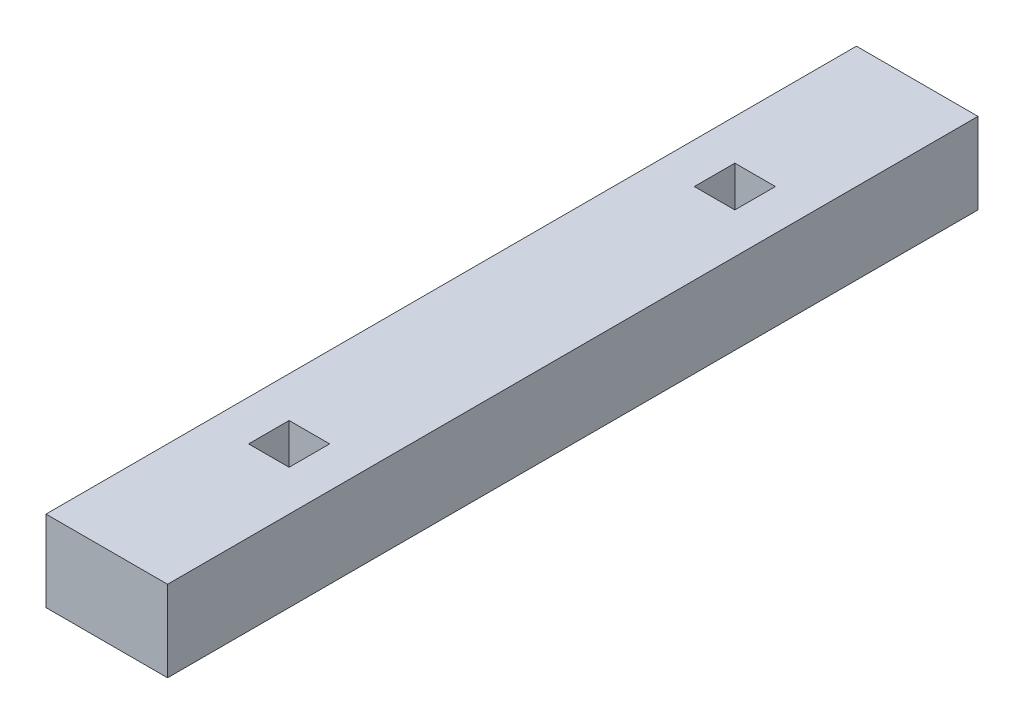
ISO-10303-21;
HEADER;
FILE_DESCRIPTION(('STEP AP214'),'2;1');
FILE_NAME('part.step','',(''),(''),'','','');
FILE_SCHEMA(('AUTOMOTIVE_DESIGN { 1 0 10303 214 1 1 1 1 }'));
ENDSEC;
DATA;
#1=APPLICATION_CONTEXT('core data for automotive mechanical design processes');
#2=APPLICATION_PROTOCOL_DEFINITION('international standard','automotive_design',2000,#1);
#3=PRODUCT_CONTEXT('',#1,'mechanical');
#4=PRODUCT('Part','Part','',(#3));
#5=PRODUCT_RELATED_PRODUCT_CATEGORY('part','',(#4));
#6=PRODUCT_DEFINITION_FORMATION('','',#4);
#7=PRODUCT_DEFINITION_CONTEXT('part definition',#1,'design');
#8=PRODUCT_DEFINITION('design','',#6,#7);
#9=PRODUCT_DEFINITION_SHAPE('','',#8);
#10=(LENGTH_UNIT() NAMED_UNIT(*) SI_UNIT(.MILLI.,.METRE.));
#11=(NAMED_UNIT(*) PLANE_ANGLE_UNIT() SI_UNIT($,.RADIAN.));
#12=(NAMED_UNIT(*) SI_UNIT($,.STERADIAN.) SOLID_ANGLE_UNIT());
#13=UNCERTAINTY_MEASURE_WITH_UNIT(LENGTH_MEASURE(1.E-05),#10,'distance_accuracy_value','');
#14=(GEOMETRIC_REPRESENTATION_CONTEXT(3) GLOBAL_UNCERTAINTY_ASSIGNED_CONTEXT((#13)) GLOBAL_UNIT_ASSIGNED_CONTEXT((#10,
#11,#12)) REPRESENTATION_CONTEXT('',''));
#15=CARTESIAN_POINT('',(0.,0.,0.));
#16=DIRECTION('',(0.,0.,1.));
#17=DIRECTION('',(1.,0.,0.));
#18=AXIS2_PLACEMENT_3D('',#15,#16,#17);
#19=CARTESIAN_POINT('',(0.,20.,0.));
#20=DIRECTION('',(0.,1.,0.));
#21=DIRECTION('',(0.,0.,1.));
#22=AXIS2_PLACEMENT_3D('',#19,#20,#21);
#23=PLANE('',#22);
#24=DIRECTION('',(0.,0.,1.));
#25=VECTOR('',#24,1.);
#26=CARTESIAN_POINT('',(-15.,20.,-95.));
#27=LINE('',#26,#25);
#28=CARTESIAN_POINT('',(-15.,20.,-95.));
#29=VERTEX_POINT('',#28);
#30=CARTESIAN_POINT('',(-15.,20.,105.));
#31=VERTEX_POINT('',#30);
#32=EDGE_CURVE('E189',#29,#31,#27,.T.);
#33=ORIENTED_EDGE('',*,*,#32,.T.);
#34=DIRECTION('',(1.,0.,0.));
#35=VECTOR('',#34,1.);
#36=CARTESIAN_POINT('',(-15.,20.,105.));
#37=LINE('',#36,#35);
#38=CARTESIAN_POINT('',(15.,20.,105.));
#39=VERTEX_POINT('',#38);
#40=EDGE_CURVE('E192',#31,#39,#37,.T.);
#41=ORIENTED_EDGE('',*,*,#40,.T.);
#42=DIRECTION('',(0.,0.,-1.));
#43=VECTOR('',#42,1.);
#44=CARTESIAN_POINT('',(15.,20.,-95.));
#45=LINE('',#44,#43);
#46=CARTESIAN_POINT('',(15.,20.,-95.));
#47=VERTEX_POINT('',#46);
#48=EDGE_CURVE('E195',#39,#47,#45,.T.);
#49=ORIENTED_EDGE('',*,*,#48,.T.);
#50=DIRECTION('',(-1.,0.,0.));
#51=VECTOR('',#50,1.);
#52=CARTESIAN_POINT('',(-15.,20.,-95.));
#53=LINE('',#52,#51);
#54=EDGE_CURVE('E197',#47,#29,#53,.T.);
#55=ORIENTED_EDGE('',*,*,#54,.T.);
#56=EDGE_LOOP('',(#33,#41,#49,#55));
#57=FACE_BOUND('',#56,.T.);
#58=DIRECTION('',(1.,0.,0.));
#59=VECTOR('',#58,1.);
#60=CARTESIAN_POINT('',(-5.,20.,-45.));
#61=LINE('',#60,#59);
#62=CARTESIAN_POINT('',(-5.,20.,-45.));
#63=VERTEX_POINT('',#62);
#64=CARTESIAN_POINT('',(5.,20.,-45.));
#65=VERTEX_POINT('',#64);
#66=EDGE_CURVE('E160',#63,#65,#61,.T.);
#67=ORIENTED_EDGE('',*,*,#66,.F.);
#68=DIRECTION('',(0.,0.,1.));
#69=VECTOR('',#68,1.);
#70=CARTESIAN_POINT('',(-5.,20.,-55.));
#71=LINE('',#70,#69);
#72=CARTESIAN_POINT('',(-5.,20.,-55.));
#73=VERTEX_POINT('',#72);
#74=EDGE_CURVE('E158',#73,#63,#71,.T.);
#75=ORIENTED_EDGE('',*,*,#74,.F.);
#76=DIRECTION('',(-1.,0.,0.));
#77=VECTOR('',#76,1.);
#78=CARTESIAN_POINT('',(-5.,20.,-55.));
#79=LINE('',#78,#77);
#80=CARTESIAN_POINT('',(5.,20.,-55.));
#81=VERTEX_POINT('',#80);
#82=EDGE_CURVE('E166',#81,#73,#79,.T.);
#83=ORIENTED_EDGE('',*,*,#82,.F.);
#84=DIRECTION('',(0.,0.,-1.));
#85=VECTOR('',#84,1.);
#86=CARTESIAN_POINT('',(5.,20.,-55.));
#87=LINE('',#86,#85);
#88=EDGE_CURVE('E163',#65,#81,#87,.T.);
#89=ORIENTED_EDGE('',*,*,#88,.F.);
#90=EDGE_LOOP('',(#67,#75,#83,#89));
#91=FACE_BOUND('',#90,.T.);
#92=DIRECTION('',(0.,0.,-1.));
#93=VECTOR('',#92,1.);
#94=CARTESIAN_POINT('',(5.,20.,65.));
#95=LINE('',#94,#93);
#96=CARTESIAN_POINT('',(5.,20.,65.));
#97=VERTEX_POINT('',#96);
#98=CARTESIAN_POINT('',(5.,20.,55.));
#99=VERTEX_POINT('',#98);
#100=EDGE_CURVE('E130',#97,#99,#95,.T.);
#101=ORIENTED_EDGE('',*,*,#100,.F.);
#102=DIRECTION('',(1.,0.,0.));
#103=VECTOR('',#102,1.);
#104=CARTESIAN_POINT('',(-5.,20.,65.));
#105=LINE('',#104,#103);
#106=CARTESIAN_POINT('',(-5.,20.,65.));
#107=VERTEX_POINT('',#106);
#108=EDGE_CURVE('E122',#107,#97,#105,.T.);
#109=ORIENTED_EDGE('',*,*,#108,.F.);
#110=DIRECTION('',(0.,0.,1.));
#111=VECTOR('',#110,1.);
#112=CARTESIAN_POINT('',(-5.,20.,65.));
#113=LINE('',#112,#111);
#114=CARTESIAN_POINT('',(-5.,20.,55.));
#115=VERTEX_POINT('',#114);
#116=EDGE_CURVE('E144',#115,#107,#113,.T.);
#117=ORIENTED_EDGE('',*,*,#116,.F.);
#118=DIRECTION('',(-1.,0.,0.));
#119=VECTOR('',#118,1.);
#120=CARTESIAN_POINT('',(-5.,20.,55.));
#121=LINE('',#120,#119);
#122=EDGE_CURVE('E142',#99,#115,#121,.T.);
#123=ORIENTED_EDGE('',*,*,#122,.F.);
#124=EDGE_LOOP('',(#101,#109,#117,#123));
#125=FACE_BOUND('',#124,.T.);
#126=ADVANCED_FACE('F33',(#57,#91,#125),#23,.T.);
#127=CARTESIAN_POINT('',(0.,0.,0.));
#128=DIRECTION('',(0.,1.,0.));
#129=DIRECTION('',(0.,0.,1.));
#130=AXIS2_PLACEMENT_3D('',#127,#128,#129);
#131=PLANE('',#130);
#132=DIRECTION('',(0.,0.,1.));
#133=VECTOR('',#132,1.);
#134=CARTESIAN_POINT('',(-5.,0.,-55.));
#135=LINE('',#134,#133);
#136=CARTESIAN_POINT('',(-5.,0.,-55.));
#137=VERTEX_POINT('',#136);
#138=CARTESIAN_POINT('',(-5.,0.,-45.));
#139=VERTEX_POINT('',#138);
#140=EDGE_CURVE('E138',#137,#139,#135,.T.);
#141=ORIENTED_EDGE('',*,*,#140,.T.);
#142=DIRECTION('',(1.,0.,0.));
#143=VECTOR('',#142,1.);
#144=CARTESIAN_POINT('',(-5.,0.,-45.));
#145=LINE('',#144,#143);
#146=CARTESIAN_POINT('',(5.,0.,-45.));
#147=VERTEX_POINT('',#146);
#148=EDGE_CURVE('E171',#139,#147,#145,.T.);
#149=ORIENTED_EDGE('',*,*,#148,.T.);
#150=DIRECTION('',(0.,0.,-1.));
#151=VECTOR('',#150,1.);
#152=CARTESIAN_POINT('',(5.,0.,-55.));
#153=LINE('',#152,#151);
#154=CARTESIAN_POINT('',(5.,0.,-55.));
#155=VERTEX_POINT('',#154);
#156=EDGE_CURVE('E174',#147,#155,#153,.T.);
#157=ORIENTED_EDGE('',*,*,#156,.T.);
#158=DIRECTION('',(-1.,0.,0.));
#159=VECTOR('',#158,1.);
#160=CARTESIAN_POINT('',(-5.,0.,-55.));
#161=LINE('',#160,#159);
#162=EDGE_CURVE('E161',#155,#137,#161,.T.);
#163=ORIENTED_EDGE('',*,*,#162,.T.);
#164=EDGE_LOOP('',(#141,#149,#157,#163));
#165=FACE_BOUND('',#164,.T.);
#166=DIRECTION('',(0.,0.,1.));
#167=VECTOR('',#166,1.);
#168=CARTESIAN_POINT('',(-15.,0.,-95.));
#169=LINE('',#168,#167);
#170=CARTESIAN_POINT('',(-15.,0.,-95.));
#171=VERTEX_POINT('',#170);
#172=CARTESIAN_POINT('',(-15.,0.,105.));
#173=VERTEX_POINT('',#172);
#174=EDGE_CURVE('E188',#171,#173,#169,.T.);
#175=ORIENTED_EDGE('',*,*,#174,.F.);
#176=DIRECTION('',(-1.,0.,0.));
#177=VECTOR('',#176,1.);
#178=CARTESIAN_POINT('',(-15.,0.,-95.));
#179=LINE('',#178,#177);
#180=CARTESIAN_POINT('',(15.,0.,-95.));
#181=VERTEX_POINT('',#180);
#182=EDGE_CURVE('E193',#181,#171,#179,.T.);
#183=ORIENTED_EDGE('',*,*,#182,.F.);
#184=DIRECTION('',(0.,0.,-1.));
#185=VECTOR('',#184,1.);
#186=CARTESIAN_POINT('',(15.,0.,-95.));
#187=LINE('',#186,#185);
#188=CARTESIAN_POINT('',(15.,0.,105.));
#189=VERTEX_POINT('',#188);
#190=EDGE_CURVE('E204',#189,#181,#187,.T.);
#191=ORIENTED_EDGE('',*,*,#190,.F.);
#192=DIRECTION('',(1.,0.,0.));
#193=VECTOR('',#192,1.);
#194=CARTESIAN_POINT('',(-15.,0.,105.));
#195=LINE('',#194,#193);
#196=EDGE_CURVE('E202',#173,#189,#195,.T.);
#197=ORIENTED_EDGE('',*,*,#196,.F.);
#198=EDGE_LOOP('',(#175,#183,#191,#197));
#199=FACE_BOUND('',#198,.T.);
#200=DIRECTION('',(1.,0.,0.));
#201=VECTOR('',#200,1.);
#202=CARTESIAN_POINT('',(-5.,0.,65.));
#203=LINE('',#202,#201);
#204=CARTESIAN_POINT('',(-5.,0.,65.));
#205=VERTEX_POINT('',#204);
#206=CARTESIAN_POINT('',(5.,0.,65.));
#207=VERTEX_POINT('',#206);
#208=EDGE_CURVE('E56',#205,#207,#203,.T.);
#209=ORIENTED_EDGE('',*,*,#208,.T.);
#210=DIRECTION('',(0.,0.,-1.));
#211=VECTOR('',#210,1.);
#212=CARTESIAN_POINT('',(5.,0.,65.));
#213=LINE('',#212,#211);
#214=CARTESIAN_POINT('',(5.,0.,55.));
#215=VERTEX_POINT('',#214);
#216=EDGE_CURVE('E137',#207,#215,#213,.T.);
#217=ORIENTED_EDGE('',*,*,#216,.T.);
#218=DIRECTION('',(-1.,0.,0.));
#219=VECTOR('',#218,1.);
#220=CARTESIAN_POINT('',(-5.,0.,55.));
#221=LINE('',#220,#219);
#222=CARTESIAN_POINT('',(-5.,0.,55.));
#223=VERTEX_POINT('',#222);
#224=EDGE_CURVE('E150',#215,#223,#221,.T.);
#225=ORIENTED_EDGE('',*,*,#224,.T.);
#226=DIRECTION('',(0.,0.,1.));
#227=VECTOR('',#226,1.);
#228=CARTESIAN_POINT('',(-5.,0.,65.));
#229=LINE('',#228,#227);
#230=EDGE_CURVE('E131',#223,#205,#229,.T.);
#231=ORIENTED_EDGE('',*,*,#230,.T.);
#232=EDGE_LOOP('',(#209,#217,#225,#231));
#233=FACE_BOUND('',#232,.T.);
#234=ADVANCED_FACE('F222',(#165,#199,#233),#131,.F.);
#235=CARTESIAN_POINT('',(-15.,20.,-95.));
#236=DIRECTION('',(1.,0.,0.));
#237=DIRECTION('',(0.,0.,-1.));
#238=AXIS2_PLACEMENT_3D('',#235,#236,#237);
#239=PLANE('',#238);
#240=ORIENTED_EDGE('',*,*,#174,.T.);
#241=DIRECTION('',(0.,-1.,0.));
#242=VECTOR('',#241,1.);
#243=CARTESIAN_POINT('',(-15.,20.,105.));
#244=LINE('',#243,#242);
#245=EDGE_CURVE('E11',#31,#173,#244,.T.);
#246=ORIENTED_EDGE('',*,*,#245,.F.);
#247=ORIENTED_EDGE('',*,*,#32,.F.);
#248=DIRECTION('',(0.,-1.,0.));
#249=VECTOR('',#248,1.);
#250=CARTESIAN_POINT('',(-15.,20.,-95.));
#251=LINE('',#250,#249);
#252=EDGE_CURVE('E199',#29,#171,#251,.T.);
#253=ORIENTED_EDGE('',*,*,#252,.T.);
#254=EDGE_LOOP('',(#240,#246,#247,#253));
#255=FACE_BOUND('',#254,.T.);
#256=ADVANCED_FACE('F35',(#255),#239,.F.);
#257=CARTESIAN_POINT('',(-15.,20.,105.));
#258=DIRECTION('',(0.,0.,-1.));
#259=DIRECTION('',(-1.,0.,0.));
#260=AXIS2_PLACEMENT_3D('',#257,#258,#259);
#261=PLANE('',#260);
#262=ORIENTED_EDGE('',*,*,#196,.T.);
#263=DIRECTION('',(0.,-1.,0.));
#264=VECTOR('',#263,1.);
#265=CARTESIAN_POINT('',(15.,20.,105.));
#266=LINE('',#265,#264);
#267=EDGE_CURVE('E41',#39,#189,#266,.T.);
#268=ORIENTED_EDGE('',*,*,#267,.F.);
#269=ORIENTED_EDGE('',*,*,#40,.F.);
#270=ORIENTED_EDGE('',*,*,#245,.T.);
#271=EDGE_LOOP('',(#262,#268,#269,#270));
#272=FACE_BOUND('',#271,.T.);
#273=ADVANCED_FACE('F233',(#272),#261,.F.);
#274=CARTESIAN_POINT('',(15.,20.,-95.));
#275=DIRECTION('',(-1.,0.,0.));
#276=DIRECTION('',(0.,0.,1.));
#277=AXIS2_PLACEMENT_3D('',#274,#275,#276);
#278=PLANE('',#277);
#279=ORIENTED_EDGE('',*,*,#190,.T.);
#280=DIRECTION('',(0.,-1.,0.));
#281=VECTOR('',#280,1.);
#282=CARTESIAN_POINT('',(15.,20.,-95.));
#283=LINE('',#282,#281);
#284=EDGE_CURVE('E209',#47,#181,#283,.T.);
#285=ORIENTED_EDGE('',*,*,#284,.F.);
#286=ORIENTED_EDGE('',*,*,#48,.F.);
#287=ORIENTED_EDGE('',*,*,#267,.T.);
#288=EDGE_LOOP('',(#279,#285,#286,#287));
#289=FACE_BOUND('',#288,.T.);
#290=ADVANCED_FACE('F216',(#289),#278,.F.);
#291=CARTESIAN_POINT('',(-15.,20.,-95.));
#292=DIRECTION('',(0.,0.,1.));
#293=DIRECTION('',(1.,0.,0.));
#294=AXIS2_PLACEMENT_3D('',#291,#292,#293);
#295=PLANE('',#294);
#296=ORIENTED_EDGE('',*,*,#182,.T.);
#297=ORIENTED_EDGE('',*,*,#252,.F.);
#298=ORIENTED_EDGE('',*,*,#54,.F.);
#299=ORIENTED_EDGE('',*,*,#284,.T.);
#300=EDGE_LOOP('',(#296,#297,#298,#299));
#301=FACE_BOUND('',#300,.T.);
#302=ADVANCED_FACE('F226',(#301),#295,.F.);
#303=CARTESIAN_POINT('',(-5.,20.,-55.));
#304=DIRECTION('',(1.,0.,0.));
#305=DIRECTION('',(0.,0.,-1.));
#306=AXIS2_PLACEMENT_3D('',#303,#304,#305);
#307=PLANE('',#306);
#308=ORIENTED_EDGE('',*,*,#140,.F.);
#309=DIRECTION('',(0.,-1.,0.));
#310=VECTOR('',#309,1.);
#311=CARTESIAN_POINT('',(-5.,20.,-55.));
#312=LINE('',#311,#310);
#313=EDGE_CURVE('E168',#73,#137,#312,.T.);
#314=ORIENTED_EDGE('',*,*,#313,.F.);
#315=ORIENTED_EDGE('',*,*,#74,.T.);
#316=DIRECTION('',(0.,-1.,0.));
#317=VECTOR('',#316,1.);
#318=CARTESIAN_POINT('',(-5.,20.,-45.));
#319=LINE('',#318,#317);
#320=EDGE_CURVE('E185',#63,#139,#319,.T.);
#321=ORIENTED_EDGE('',*,*,#320,.T.);
#322=EDGE_LOOP('',(#308,#314,#315,#321));
#323=FACE_BOUND('',#322,.T.);
#324=ADVANCED_FACE('F248',(#323),#307,.T.);
#325=CARTESIAN_POINT('',(-5.,20.,-45.));
#326=DIRECTION('',(0.,0.,-1.));
#327=DIRECTION('',(-1.,0.,0.));
#328=AXIS2_PLACEMENT_3D('',#325,#326,#327);
#329=PLANE('',#328);
#330=ORIENTED_EDGE('',*,*,#148,.F.);
#331=ORIENTED_EDGE('',*,*,#320,.F.);
#332=ORIENTED_EDGE('',*,*,#66,.T.);
#333=DIRECTION('',(0.,-1.,0.));
#334=VECTOR('',#333,1.);
#335=CARTESIAN_POINT('',(5.,20.,-45.));
#336=LINE('',#335,#334);
#337=EDGE_CURVE('E183',#65,#147,#336,.T.);
#338=ORIENTED_EDGE('',*,*,#337,.T.);
#339=EDGE_LOOP('',(#330,#331,#332,#338));
#340=FACE_BOUND('',#339,.T.);
#341=ADVANCED_FACE('F255',(#340),#329,.T.);
#342=CARTESIAN_POINT('',(5.,20.,-55.));
#343=DIRECTION('',(-1.,0.,0.));
#344=DIRECTION('',(0.,0.,1.));
#345=AXIS2_PLACEMENT_3D('',#342,#343,#344);
#346=PLANE('',#345);
#347=ORIENTED_EDGE('',*,*,#156,.F.);
#348=ORIENTED_EDGE('',*,*,#337,.F.);
#349=ORIENTED_EDGE('',*,*,#88,.T.);
#350=DIRECTION('',(0.,-1.,0.));
#351=VECTOR('',#350,1.);
#352=CARTESIAN_POINT('',(5.,20.,-55.));
#353=LINE('',#352,#351);
#354=EDGE_CURVE('E181',#81,#155,#353,.T.);
#355=ORIENTED_EDGE('',*,*,#354,.T.);
#356=EDGE_LOOP('',(#347,#348,#349,#355));
#357=FACE_BOUND('',#356,.T.);
#358=ADVANCED_FACE('F260',(#357),#346,.T.);
#359=CARTESIAN_POINT('',(-5.,20.,-55.));
#360=DIRECTION('',(0.,0.,1.));
#361=DIRECTION('',(1.,0.,0.));
#362=AXIS2_PLACEMENT_3D('',#359,#360,#361);
#363=PLANE('',#362);
#364=ORIENTED_EDGE('',*,*,#162,.F.);
#365=ORIENTED_EDGE('',*,*,#354,.F.);
#366=ORIENTED_EDGE('',*,*,#82,.T.);
#367=ORIENTED_EDGE('',*,*,#313,.T.);
#368=EDGE_LOOP('',(#364,#365,#366,#367));
#369=FACE_BOUND('',#368,.T.);
#370=ADVANCED_FACE('F267',(#369),#363,.T.);
#371=CARTESIAN_POINT('',(-5.,20.,65.));
#372=DIRECTION('',(0.,0.,-1.));
#373=DIRECTION('',(-1.,0.,0.));
#374=AXIS2_PLACEMENT_3D('',#371,#372,#373);
#375=PLANE('',#374);
#376=ORIENTED_EDGE('',*,*,#208,.F.);
#377=DIRECTION('',(0.,-1.,0.));
#378=VECTOR('',#377,1.);
#379=CARTESIAN_POINT('',(-5.,20.,65.));
#380=LINE('',#379,#378);
#381=EDGE_CURVE('E126',#107,#205,#380,.T.);
#382=ORIENTED_EDGE('',*,*,#381,.F.);
#383=ORIENTED_EDGE('',*,*,#108,.T.);
#384=DIRECTION('',(0.,-1.,0.));
#385=VECTOR('',#384,1.);
#386=CARTESIAN_POINT('',(5.,20.,65.));
#387=LINE('',#386,#385);
#388=EDGE_CURVE('E125',#97,#207,#387,.T.);
#389=ORIENTED_EDGE('',*,*,#388,.T.);
#390=EDGE_LOOP('',(#376,#382,#383,#389));
#391=FACE_BOUND('',#390,.T.);
#392=ADVANCED_FACE('F124',(#391),#375,.T.);
#393=CARTESIAN_POINT('',(5.,20.,65.));
#394=DIRECTION('',(-1.,0.,0.));
#395=DIRECTION('',(0.,0.,1.));
#396=AXIS2_PLACEMENT_3D('',#393,#394,#395);
#397=PLANE('',#396);
#398=ORIENTED_EDGE('',*,*,#216,.F.);
#399=ORIENTED_EDGE('',*,*,#388,.F.);
#400=ORIENTED_EDGE('',*,*,#100,.T.);
#401=DIRECTION('',(0.,-1.,0.));
#402=VECTOR('',#401,1.);
#403=CARTESIAN_POINT('',(5.,20.,55.));
#404=LINE('',#403,#402);
#405=EDGE_CURVE('E139',#99,#215,#404,.T.);
#406=ORIENTED_EDGE('',*,*,#405,.T.);
#407=EDGE_LOOP('',(#398,#399,#400,#406));
#408=FACE_BOUND('',#407,.T.);
#409=ADVANCED_FACE('F134',(#408),#397,.T.);
#410=CARTESIAN_POINT('',(-5.,20.,55.));
#411=DIRECTION('',(0.,0.,1.));
#412=DIRECTION('',(1.,0.,0.));
#413=AXIS2_PLACEMENT_3D('',#410,#411,#412);
#414=PLANE('',#413);
#415=ORIENTED_EDGE('',*,*,#224,.F.);
#416=ORIENTED_EDGE('',*,*,#405,.F.);
#417=ORIENTED_EDGE('',*,*,#122,.T.);
#418=DIRECTION('',(0.,-1.,0.));
#419=VECTOR('',#418,1.);
#420=CARTESIAN_POINT('',(-5.,20.,55.));
#421=LINE('',#420,#419);
#422=EDGE_CURVE('E48',#115,#223,#421,.T.);
#423=ORIENTED_EDGE('',*,*,#422,.T.);
#424=EDGE_LOOP('',(#415,#416,#417,#423));
#425=FACE_BOUND('',#424,.T.);
#426=ADVANCED_FACE('F285',(#425),#414,.T.);
#427=CARTESIAN_POINT('',(-5.,20.,65.));
#428=DIRECTION('',(1.,0.,0.));
#429=DIRECTION('',(0.,0.,-1.));
#430=AXIS2_PLACEMENT_3D('',#427,#428,#429);
#431=PLANE('',#430);
#432=ORIENTED_EDGE('',*,*,#230,.F.);
#433=ORIENTED_EDGE('',*,*,#422,.F.);
#434=ORIENTED_EDGE('',*,*,#116,.T.);
#435=ORIENTED_EDGE('',*,*,#381,.T.);
#436=EDGE_LOOP('',(#432,#433,#434,#435));
#437=FACE_BOUND('',#436,.T.);
#438=ADVANCED_FACE('F288',(#437),#431,.T.);
#439=CLOSED_SHELL('',(#126,#234,#256,#273,#290,#302,#324,#341,#358,#370,#392,#409,#426,#438));
#440=MANIFOLD_SOLID_BREP('B2',#439);
#441=ADVANCED_BREP_SHAPE_REPRESENTATION('',(#18,#440),#14);
#442=SHAPE_DEFINITION_REPRESENTATION(#9,#441);
ENDSEC;
END-ISO-10303-21;
